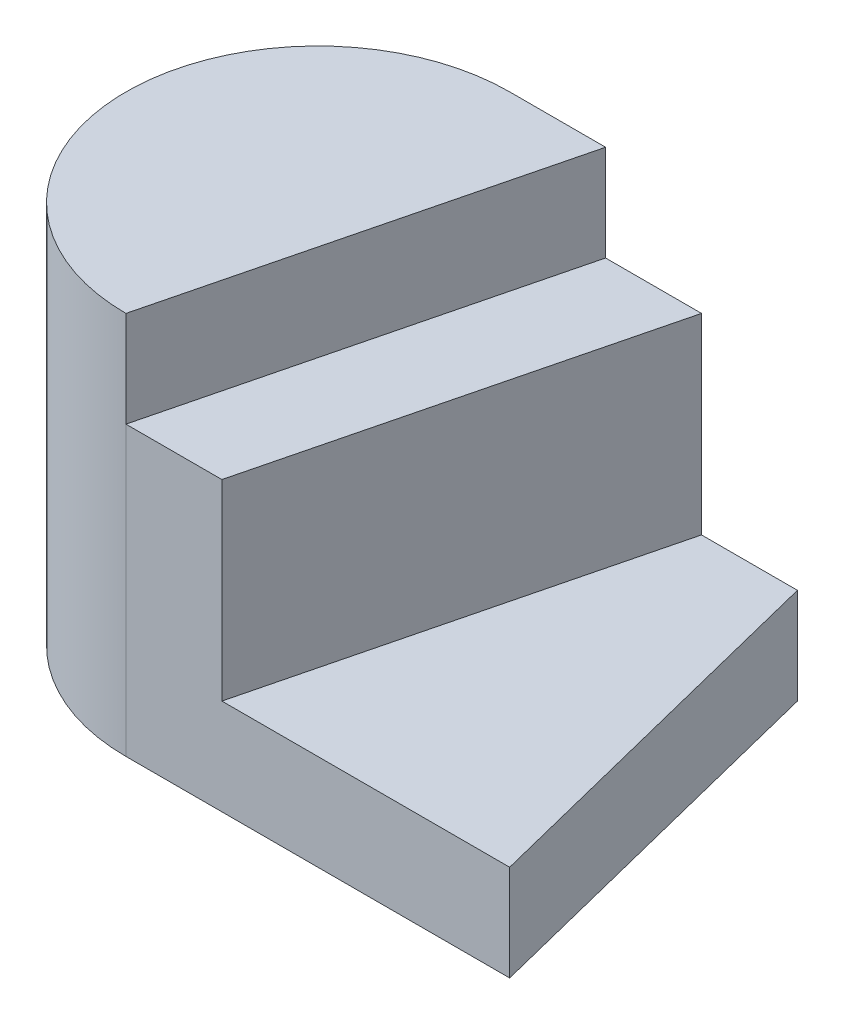
ISO-10303-21;
HEADER;
FILE_DESCRIPTION(('STEP AP214'),'2;1');
FILE_NAME('part.step','',(''),(''),'','','');
FILE_SCHEMA(('AUTOMOTIVE_DESIGN { 1 0 10303 214 1 1 1 1 }'));
ENDSEC;
DATA;
#1=APPLICATION_CONTEXT('core data for automotive mechanical design processes');
#2=APPLICATION_PROTOCOL_DEFINITION('international standard','automotive_design',2000,#1);
#3=PRODUCT_CONTEXT('',#1,'mechanical');
#4=PRODUCT('Part','Part','',(#3));
#5=PRODUCT_RELATED_PRODUCT_CATEGORY('part','',(#4));
#6=PRODUCT_DEFINITION_FORMATION('','',#4);
#7=PRODUCT_DEFINITION_CONTEXT('part definition',#1,'design');
#8=PRODUCT_DEFINITION('design','',#6,#7);
#9=PRODUCT_DEFINITION_SHAPE('','',#8);
#10=(LENGTH_UNIT() NAMED_UNIT(*) SI_UNIT(.MILLI.,.METRE.));
#11=(NAMED_UNIT(*) PLANE_ANGLE_UNIT() SI_UNIT($,.RADIAN.));
#12=(NAMED_UNIT(*) SI_UNIT($,.STERADIAN.) SOLID_ANGLE_UNIT());
#13=UNCERTAINTY_MEASURE_WITH_UNIT(LENGTH_MEASURE(1.E-05),#10,'distance_accuracy_value','');
#14=(GEOMETRIC_REPRESENTATION_CONTEXT(3) GLOBAL_UNCERTAINTY_ASSIGNED_CONTEXT((#13)) GLOBAL_UNIT_ASSIGNED_CONTEXT((#10,
#11,#12)) REPRESENTATION_CONTEXT('',''));
#15=CARTESIAN_POINT('',(0.,0.,0.));
#16=DIRECTION('',(0.,0.,1.));
#17=DIRECTION('',(1.,0.,0.));
#18=AXIS2_PLACEMENT_3D('',#15,#16,#17);
#19=CARTESIAN_POINT('',(20.,20.,10.));
#20=DIRECTION('',(0.,0.,-1.));
#21=DIRECTION('',(-1.,0.,0.));
#22=AXIS2_PLACEMENT_3D('',#19,#20,#21);
#23=PLANE('',#22);
#24=DIRECTION('',(0.,-1.,0.));
#25=VECTOR('',#24,1.);
#26=CARTESIAN_POINT('',(5.,20.,10.));
#27=LINE('',#26,#25);
#28=CARTESIAN_POINT('',(5.,15.,10.));
#29=VERTEX_POINT('',#28);
#30=CARTESIAN_POINT('',(5.,5.,10.));
#31=VERTEX_POINT('',#30);
#32=EDGE_CURVE('E136',#29,#31,#27,.T.);
#33=ORIENTED_EDGE('',*,*,#32,.F.);
#34=DIRECTION('',(1.,0.,0.));
#35=VECTOR('',#34,1.);
#36=CARTESIAN_POINT('',(0.,15.,10.));
#37=LINE('',#36,#35);
#38=CARTESIAN_POINT('',(0.,15.,10.));
#39=VERTEX_POINT('',#38);
#40=EDGE_CURVE('E114',#39,#29,#37,.T.);
#41=ORIENTED_EDGE('',*,*,#40,.F.);
#42=DIRECTION('',(0.,-1.,0.));
#43=VECTOR('',#42,1.);
#44=CARTESIAN_POINT('',(0.,20.,10.));
#45=LINE('',#44,#43);
#46=CARTESIAN_POINT('',(0.,0.,10.));
#47=VERTEX_POINT('',#46);
#48=EDGE_CURVE('E41',#39,#47,#45,.T.);
#49=ORIENTED_EDGE('',*,*,#48,.T.);
#50=DIRECTION('',(1.,0.,0.));
#51=VECTOR('',#50,1.);
#52=CARTESIAN_POINT('',(20.,0.,10.));
#53=LINE('',#52,#51);
#54=CARTESIAN_POINT('',(20.,0.,10.));
#55=VERTEX_POINT('',#54);
#56=EDGE_CURVE('E97',#47,#55,#53,.T.);
#57=ORIENTED_EDGE('',*,*,#56,.T.);
#58=DIRECTION('',(0.,-1.,0.));
#59=VECTOR('',#58,1.);
#60=CARTESIAN_POINT('',(20.,20.,10.));
#61=LINE('',#60,#59);
#62=CARTESIAN_POINT('',(20.,5.,10.));
#63=VERTEX_POINT('',#62);
#64=EDGE_CURVE('E87',#63,#55,#61,.T.);
#65=ORIENTED_EDGE('',*,*,#64,.F.);
#66=DIRECTION('',(1.,0.,0.));
#67=VECTOR('',#66,1.);
#68=CARTESIAN_POINT('',(5.,5.,10.));
#69=LINE('',#68,#67);
#70=EDGE_CURVE('E142',#31,#63,#69,.T.);
#71=ORIENTED_EDGE('',*,*,#70,.F.);
#72=EDGE_LOOP('',(#33,#41,#49,#57,#65,#71));
#73=FACE_BOUND('',#72,.T.);
#74=ADVANCED_FACE('F33',(#73),#23,.F.);
#75=CARTESIAN_POINT('',(15.,20.,-10.));
#76=DIRECTION('',(-0.970142500145332,0.,0.242535625036333));
#77=DIRECTION('',(0.242535625036333,0.,0.970142500145332));
#78=AXIS2_PLACEMENT_3D('',#75,#76,#77);
#79=PLANE('',#78);
#80=DIRECTION('',(-0.242535625036333,0.,-0.970142500145332));
#81=VECTOR('',#80,1.);
#82=CARTESIAN_POINT('',(20.,5.,10.));
#83=LINE('',#82,#81);
#84=CARTESIAN_POINT('',(15.,5.,-10.));
#85=VERTEX_POINT('',#84);
#86=EDGE_CURVE('E139',#63,#85,#83,.T.);
#87=ORIENTED_EDGE('',*,*,#86,.F.);
#88=ORIENTED_EDGE('',*,*,#64,.T.);
#89=DIRECTION('',(-0.242535625036333,0.,-0.970142500145332));
#90=VECTOR('',#89,1.);
#91=CARTESIAN_POINT('',(15.,0.,-10.));
#92=LINE('',#91,#90);
#93=CARTESIAN_POINT('',(15.,0.,-10.));
#94=VERTEX_POINT('',#93);
#95=EDGE_CURVE('E91',#55,#94,#92,.T.);
#96=ORIENTED_EDGE('',*,*,#95,.T.);
#97=DIRECTION('',(0.,-1.,0.));
#98=VECTOR('',#97,1.);
#99=CARTESIAN_POINT('',(15.,20.,-10.));
#100=LINE('',#99,#98);
#101=EDGE_CURVE('E75',#85,#94,#100,.T.);
#102=ORIENTED_EDGE('',*,*,#101,.F.);
#103=EDGE_LOOP('',(#87,#88,#96,#102));
#104=FACE_BOUND('',#103,.T.);
#105=ADVANCED_FACE('F92',(#104),#79,.F.);
#106=CARTESIAN_POINT('',(0.,20.,-10.));
#107=DIRECTION('',(0.,0.,1.));
#108=DIRECTION('',(1.,0.,0.));
#109=AXIS2_PLACEMENT_3D('',#106,#107,#108);
#110=PLANE('',#109);
#111=DIRECTION('',(0.,-1.,0.));
#112=VECTOR('',#111,1.);
#113=CARTESIAN_POINT('',(10.,20.,-10.));
#114=LINE('',#113,#112);
#115=CARTESIAN_POINT('',(10.,15.,-10.));
#116=VERTEX_POINT('',#115);
#117=CARTESIAN_POINT('',(10.,5.,-10.));
#118=VERTEX_POINT('',#117);
#119=EDGE_CURVE('E126',#116,#118,#114,.T.);
#120=ORIENTED_EDGE('',*,*,#119,.T.);
#121=DIRECTION('',(-1.,0.,0.));
#122=VECTOR('',#121,1.);
#123=CARTESIAN_POINT('',(15.,5.,-10.));
#124=LINE('',#123,#122);
#125=EDGE_CURVE('E84',#85,#118,#124,.T.);
#126=ORIENTED_EDGE('',*,*,#125,.F.);
#127=ORIENTED_EDGE('',*,*,#101,.T.);
#128=DIRECTION('',(-1.,0.,0.));
#129=VECTOR('',#128,1.);
#130=CARTESIAN_POINT('',(0.,0.,-10.));
#131=LINE('',#130,#129);
#132=CARTESIAN_POINT('',(0.,0.,-10.));
#133=VERTEX_POINT('',#132);
#134=EDGE_CURVE('E80',#94,#133,#131,.T.);
#135=ORIENTED_EDGE('',*,*,#134,.T.);
#136=DIRECTION('',(0.,-1.,0.));
#137=VECTOR('',#136,1.);
#138=CARTESIAN_POINT('',(0.,20.,-10.));
#139=LINE('',#138,#137);
#140=CARTESIAN_POINT('',(0.,20.,-10.));
#141=VERTEX_POINT('',#140);
#142=EDGE_CURVE('E88',#141,#133,#139,.T.);
#143=ORIENTED_EDGE('',*,*,#142,.F.);
#144=DIRECTION('',(-1.,0.,0.));
#145=VECTOR('',#144,1.);
#146=CARTESIAN_POINT('',(0.,20.,-10.));
#147=LINE('',#146,#145);
#148=CARTESIAN_POINT('',(5.,20.,-10.));
#149=VERTEX_POINT('',#148);
#150=EDGE_CURVE('E56',#149,#141,#147,.T.);
#151=ORIENTED_EDGE('',*,*,#150,.F.);
#152=DIRECTION('',(0.,1.,0.));
#153=VECTOR('',#152,1.);
#154=CARTESIAN_POINT('',(5.,15.,-10.));
#155=LINE('',#154,#153);
#156=CARTESIAN_POINT('',(5.,15.,-10.));
#157=VERTEX_POINT('',#156);
#158=EDGE_CURVE('E48',#157,#149,#155,.T.);
#159=ORIENTED_EDGE('',*,*,#158,.F.);
#160=DIRECTION('',(-1.,0.,0.));
#161=VECTOR('',#160,1.);
#162=CARTESIAN_POINT('',(5.,15.,-10.));
#163=LINE('',#162,#161);
#164=EDGE_CURVE('E125',#116,#157,#163,.T.);
#165=ORIENTED_EDGE('',*,*,#164,.F.);
#166=EDGE_LOOP('',(#120,#126,#127,#135,#143,#151,#159,#165));
#167=FACE_BOUND('',#166,.T.);
#168=ADVANCED_FACE('F78',(#167),#110,.F.);
#169=CARTESIAN_POINT('',(0.,20.,0.));
#170=DIRECTION('',(0.,-1.,0.));
#171=DIRECTION('',(0.,0.,-1.));
#172=AXIS2_PLACEMENT_3D('',#169,#170,#171);
#173=CYLINDRICAL_SURFACE('',#172,10.);
#174=CARTESIAN_POINT('',(0.,0.,0.));
#175=DIRECTION('',(0.,1.,0.));
#176=DIRECTION('',(0.,0.,1.));
#177=AXIS2_PLACEMENT_3D('',#174,#175,#176);
#178=CIRCLE('',#177,10.);
#179=EDGE_CURVE('E102',#133,#47,#178,.T.);
#180=ORIENTED_EDGE('',*,*,#179,.T.);
#181=ORIENTED_EDGE('',*,*,#48,.F.);
#182=CARTESIAN_POINT('',(0.,20.,10.));
#183=VERTEX_POINT('',#182);
#184=EDGE_CURVE('E11',#183,#39,#45,.T.);
#185=ORIENTED_EDGE('',*,*,#184,.F.);
#186=CARTESIAN_POINT('',(0.,20.,0.));
#187=DIRECTION('',(0.,1.,0.));
#188=DIRECTION('',(0.,0.,1.));
#189=AXIS2_PLACEMENT_3D('',#186,#187,#188);
#190=CIRCLE('',#189,10.);
#191=EDGE_CURVE('E103',#141,#183,#190,.T.);
#192=ORIENTED_EDGE('',*,*,#191,.F.);
#193=ORIENTED_EDGE('',*,*,#142,.T.);
#194=EDGE_LOOP('',(#180,#181,#185,#192,#193));
#195=FACE_BOUND('',#194,.T.);
#196=ADVANCED_FACE('F35',(#195),#173,.T.);
#197=CARTESIAN_POINT('',(0.,20.,0.));
#198=DIRECTION('',(0.,1.,0.));
#199=DIRECTION('',(0.,0.,1.));
#200=AXIS2_PLACEMENT_3D('',#197,#198,#199);
#201=PLANE('',#200);
#202=DIRECTION('',(-0.242535625036333,0.,0.970142500145332));
#203=VECTOR('',#202,1.);
#204=CARTESIAN_POINT('',(5.,20.,-10.));
#205=LINE('',#204,#203);
#206=EDGE_CURVE('E123',#149,#183,#205,.T.);
#207=ORIENTED_EDGE('',*,*,#206,.F.);
#208=ORIENTED_EDGE('',*,*,#150,.T.);
#209=ORIENTED_EDGE('',*,*,#191,.T.);
#210=EDGE_LOOP('',(#207,#208,#209));
#211=FACE_BOUND('',#210,.T.);
#212=ADVANCED_FACE('F171',(#211),#201,.T.);
#213=CARTESIAN_POINT('',(0.,0.,0.));
#214=DIRECTION('',(0.,1.,0.));
#215=DIRECTION('',(0.,0.,1.));
#216=AXIS2_PLACEMENT_3D('',#213,#214,#215);
#217=PLANE('',#216);
#218=ORIENTED_EDGE('',*,*,#179,.F.);
#219=ORIENTED_EDGE('',*,*,#134,.F.);
#220=ORIENTED_EDGE('',*,*,#95,.F.);
#221=ORIENTED_EDGE('',*,*,#56,.F.);
#222=EDGE_LOOP('',(#218,#219,#220,#221));
#223=FACE_BOUND('',#222,.T.);
#224=ADVANCED_FACE('F100',(#223),#217,.F.);
#225=CARTESIAN_POINT('',(5.,15.,-10.));
#226=DIRECTION('',(-0.970142500145332,0.,-0.242535625036333));
#227=DIRECTION('',(-0.242535625036333,0.,0.970142500145332));
#228=AXIS2_PLACEMENT_3D('',#225,#226,#227);
#229=PLANE('',#228);
#230=ORIENTED_EDGE('',*,*,#206,.T.);
#231=ORIENTED_EDGE('',*,*,#184,.T.);
#232=DIRECTION('',(-0.242535625036333,0.,0.970142500145332));
#233=VECTOR('',#232,1.);
#234=CARTESIAN_POINT('',(5.,15.,-10.));
#235=LINE('',#234,#233);
#236=EDGE_CURVE('E130',#157,#39,#235,.T.);
#237=ORIENTED_EDGE('',*,*,#236,.F.);
#238=ORIENTED_EDGE('',*,*,#158,.T.);
#239=EDGE_LOOP('',(#230,#231,#237,#238));
#240=FACE_BOUND('',#239,.T.);
#241=ADVANCED_FACE('F170',(#240),#229,.F.);
#242=CARTESIAN_POINT('',(0.,15.,0.));
#243=DIRECTION('',(0.,-1.,0.));
#244=DIRECTION('',(0.,0.,-1.));
#245=AXIS2_PLACEMENT_3D('',#242,#243,#244);
#246=PLANE('',#245);
#247=ORIENTED_EDGE('',*,*,#164,.T.);
#248=ORIENTED_EDGE('',*,*,#236,.T.);
#249=ORIENTED_EDGE('',*,*,#40,.T.);
#250=DIRECTION('',(0.242535625036333,0.,-0.970142500145332));
#251=VECTOR('',#250,1.);
#252=CARTESIAN_POINT('',(10.,15.,-10.));
#253=LINE('',#252,#251);
#254=EDGE_CURVE('E119',#29,#116,#253,.T.);
#255=ORIENTED_EDGE('',*,*,#254,.T.);
#256=EDGE_LOOP('',(#247,#248,#249,#255));
#257=FACE_BOUND('',#256,.T.);
#258=ADVANCED_FACE('F162',(#257),#246,.F.);
#259=CARTESIAN_POINT('',(10.,20.,-10.));
#260=DIRECTION('',(0.970142500145332,0.,0.242535625036333));
#261=DIRECTION('',(0.242535625036333,0.,-0.970142500145332));
#262=AXIS2_PLACEMENT_3D('',#259,#260,#261);
#263=PLANE('',#262);
#264=ORIENTED_EDGE('',*,*,#254,.F.);
#265=ORIENTED_EDGE('',*,*,#32,.T.);
#266=DIRECTION('',(-0.242535625036333,0.,0.970142500145332));
#267=VECTOR('',#266,1.);
#268=CARTESIAN_POINT('',(10.,5.,-10.));
#269=LINE('',#268,#267);
#270=EDGE_CURVE('E145',#118,#31,#269,.T.);
#271=ORIENTED_EDGE('',*,*,#270,.F.);
#272=ORIENTED_EDGE('',*,*,#119,.F.);
#273=EDGE_LOOP('',(#264,#265,#271,#272));
#274=FACE_BOUND('',#273,.T.);
#275=ADVANCED_FACE('F159',(#274),#263,.T.);
#276=CARTESIAN_POINT('',(0.,5.,0.));
#277=DIRECTION('',(0.,1.,0.));
#278=DIRECTION('',(0.,0.,1.));
#279=AXIS2_PLACEMENT_3D('',#276,#277,#278);
#280=PLANE('',#279);
#281=ORIENTED_EDGE('',*,*,#125,.T.);
#282=ORIENTED_EDGE('',*,*,#270,.T.);
#283=ORIENTED_EDGE('',*,*,#70,.T.);
#284=ORIENTED_EDGE('',*,*,#86,.T.);
#285=EDGE_LOOP('',(#281,#282,#283,#284));
#286=FACE_BOUND('',#285,.T.);
#287=ADVANCED_FACE('F150',(#286),#280,.T.);
#288=CLOSED_SHELL('',(#74,#105,#168,#196,#212,#224,#241,#258,#275,#287));
#289=MANIFOLD_SOLID_BREP('B2',#288);
#290=ADVANCED_BREP_SHAPE_REPRESENTATION('',(#18,#289),#14);
#291=SHAPE_DEFINITION_REPRESENTATION(#9,#290);
ENDSEC;
END-ISO-10303-21;
